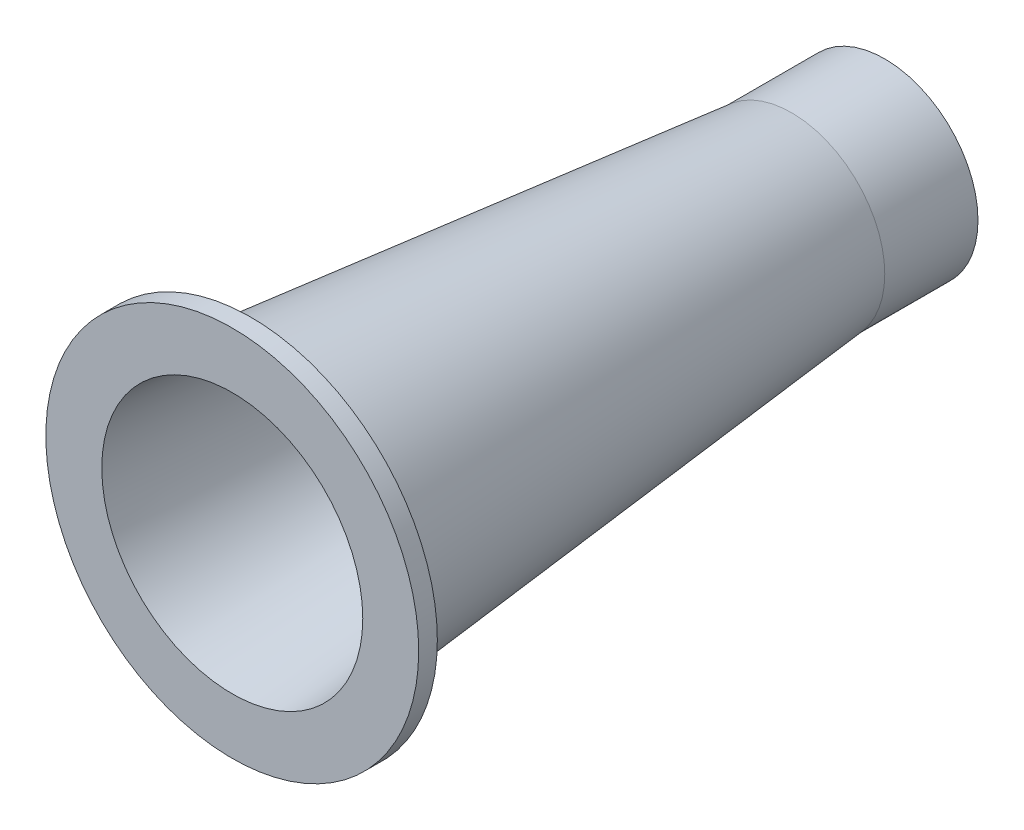
ISO-10303-21;
HEADER;
FILE_DESCRIPTION(('STEP AP214'),'2;1');
FILE_NAME('part.step','',(''),(''),'','','');
FILE_SCHEMA(('AUTOMOTIVE_DESIGN { 1 0 10303 214 1 1 1 1 }'));
ENDSEC;
DATA;
#1=APPLICATION_CONTEXT('core data for automotive mechanical design processes');
#2=APPLICATION_PROTOCOL_DEFINITION('international standard','automotive_design',2000,#1);
#3=PRODUCT_CONTEXT('',#1,'mechanical');
#4=PRODUCT('Part','Part','',(#3));
#5=PRODUCT_RELATED_PRODUCT_CATEGORY('part','',(#4));
#6=PRODUCT_DEFINITION_FORMATION('','',#4);
#7=PRODUCT_DEFINITION_CONTEXT('part definition',#1,'design');
#8=PRODUCT_DEFINITION('design','',#6,#7);
#9=PRODUCT_DEFINITION_SHAPE('','',#8);
#10=(LENGTH_UNIT() NAMED_UNIT(*) SI_UNIT(.MILLI.,.METRE.));
#11=(NAMED_UNIT(*) PLANE_ANGLE_UNIT() SI_UNIT($,.RADIAN.));
#12=(NAMED_UNIT(*) SI_UNIT($,.STERADIAN.) SOLID_ANGLE_UNIT());
#13=UNCERTAINTY_MEASURE_WITH_UNIT(LENGTH_MEASURE(1.E-05),#10,'distance_accuracy_value','');
#14=(GEOMETRIC_REPRESENTATION_CONTEXT(3) GLOBAL_UNCERTAINTY_ASSIGNED_CONTEXT((#13)) GLOBAL_UNIT_ASSIGNED_CONTEXT((#10,
#11,#12)) REPRESENTATION_CONTEXT('',''));
#15=CARTESIAN_POINT('',(0.,0.,0.));
#16=DIRECTION('',(0.,0.,1.));
#17=DIRECTION('',(1.,0.,0.));
#18=AXIS2_PLACEMENT_3D('',#15,#16,#17);
#19=CARTESIAN_POINT('',(0.,0.,396.040868454661));
#20=DIRECTION('',(0.,0.,1.));
#21=DIRECTION('',(1.,0.,0.));
#22=AXIS2_PLACEMENT_3D('',#19,#20,#21);
#23=CYLINDRICAL_SURFACE('',#22,60.);
#24=CARTESIAN_POINT('',(0.,-60.,-657.));
#25=CARTESIAN_POINT('',(0.168398425366573,-59.9999989965882,-657.000007431921));
#26=CARTESIAN_POINT('',(0.336916273700071,-59.9992834563851,-657.014226636527));
#27=CARTESIAN_POINT('',(0.669303160455142,-59.9964978138004,-657.070748210421));
#28=CARTESIAN_POINT('',(0.833166484017547,-59.9944261154742,-657.113083668137));
#29=CARTESIAN_POINT('',(1.15138127513098,-59.989162638132,-657.224622608319));
#30=CARTESIAN_POINT('',(1.30573754383423,-59.9859714300226,-657.293812398028));
#31=CARTESIAN_POINT('',(1.6006031183757,-59.9788283403306,-657.45707491939));
#32=CARTESIAN_POINT('',(1.74111568222386,-59.9748766383741,-657.551141777122));
#33=CARTESIAN_POINT('',(2.00448897861873,-59.966652640661,-657.761594016113));
#34=CARTESIAN_POINT('',(2.12733400216983,-59.9623800646756,-657.877999047214));
#35=CARTESIAN_POINT('',(2.3517512366424,-59.9539982806557,-658.12978409701));
#36=CARTESIAN_POINT('',(2.45332257857177,-59.9498890793003,-658.265164890454));
#37=CARTESIAN_POINT('',(2.63235251668381,-59.9422954402047,-658.551140898044));
#38=CARTESIAN_POINT('',(2.70979884649505,-59.9388113206681,-658.701743800503));
#39=CARTESIAN_POINT('',(2.83830164594438,-59.9328641533935,-659.013834844799));
#40=CARTESIAN_POINT('',(2.88935831584612,-59.9304010979069,-659.17532290402));
#41=CARTESIAN_POINT('',(2.9635909845662,-59.9267763445088,-659.504455710323));
#42=CARTESIAN_POINT('',(2.98679048574661,-59.9256135496585,-659.672095144403));
#43=CARTESIAN_POINT('',(3.00472278110481,-59.9247171500117,-660.00889267221));
#44=CARTESIAN_POINT('',(2.99945579992836,-59.9249835339367,-660.178050753942));
#45=CARTESIAN_POINT('',(2.96062422003688,-59.9269144325577,-660.512924048698));
#46=CARTESIAN_POINT('',(2.92708501549788,-59.9285776925714,-660.678642214643));
#47=CARTESIAN_POINT('',(2.83270039615192,-59.9331129014293,-661.002093342115));
#48=CARTESIAN_POINT('',(2.77185486595917,-59.935984855381,-661.159826269895));
#49=CARTESIAN_POINT('',(2.62455577656859,-59.9426152038194,-661.462911266187));
#50=CARTESIAN_POINT('',(2.53809063997976,-59.946373998909,-661.608257698977));
#51=CARTESIAN_POINT('',(2.34201520162709,-59.9543539680297,-661.882382210083));
#52=CARTESIAN_POINT('',(2.23240473652195,-59.9585751453237,-662.011160171462));
#53=CARTESIAN_POINT('',(1.99300677586315,-59.9670096874912,-662.248640009832));
#54=CARTESIAN_POINT('',(1.86319728955727,-59.9712230387246,-662.357319720174));
#55=CARTESIAN_POINT('',(1.58716338785269,-59.9791625847058,-662.551347226746));
#56=CARTESIAN_POINT('',(1.44093896841631,-59.9828887793337,-662.636695017235));
#57=CARTESIAN_POINT('',(1.13621301053085,-59.9894342275824,-662.781633846669));
#58=CARTESIAN_POINT('',(0.977711103566117,-59.9922534539668,-662.841224112135));
#59=CARTESIAN_POINT('',(0.652935212547705,-59.9966668370138,-662.932941852899));
#60=CARTESIAN_POINT('',(0.486661286687232,-59.9982610028474,-662.96506953379));
#61=CARTESIAN_POINT('',(0.151253702162955,-60.0000434206509,-663.000922797746));
#62=CARTESIAN_POINT('',(-0.0178766713640324,-60.0002331903175,-663.004679041221));
#63=CARTESIAN_POINT('',(-0.354365321301494,-59.999189457873,-662.983762817802));
#64=CARTESIAN_POINT('',(-0.521723603570982,-59.9979559604692,-662.959090444931));
#65=CARTESIAN_POINT('',(-0.849831465637813,-59.9942056030387,-662.882042724158));
#66=CARTESIAN_POINT('',(-1.01058434089033,-59.9916893915727,-662.829681375741));
#67=CARTESIAN_POINT('',(-1.32101971649451,-59.9856568973259,-662.698756244382));
#68=CARTESIAN_POINT('',(-1.47070215311565,-59.9821406087885,-662.620192310609));
#69=CARTESIAN_POINT('',(-1.75488849568968,-59.9744997452751,-662.439013653492));
#70=CARTESIAN_POINT('',(-1.88937928443245,-59.9703746516084,-662.336378377444));
#71=CARTESIAN_POINT('',(-2.1392327405047,-59.9619824717785,-662.110000503459));
#72=CARTESIAN_POINT('',(-2.25459528510915,-59.9577153847046,-661.986257770108));
#73=CARTESIAN_POINT('',(-2.46302075432039,-59.9495158358195,-661.721045687419));
#74=CARTESIAN_POINT('',(-2.55606384132493,-59.9455836736774,-661.579560737544));
#75=CARTESIAN_POINT('',(-2.71707365770782,-59.9385020964914,-661.282959291433));
#76=CARTESIAN_POINT('',(-2.78504049622024,-59.935352678041,-661.127842854527));
#77=CARTESIAN_POINT('',(-2.89393389885176,-59.9301938722536,-660.808455114927));
#78=CARTESIAN_POINT('',(-2.93487310952031,-59.9281839517942,-660.644188132957));
#79=CARTESIAN_POINT('',(-2.98859050542166,-59.9255292941806,-660.311101771974));
#80=CARTESIAN_POINT('',(-3.00136885053596,-59.9248845492757,-660.142282418812));
#81=CARTESIAN_POINT('',(-2.99840026325555,-59.9250331419076,-659.80508095271));
#82=CARTESIAN_POINT('',(-2.9826845390706,-59.9258249061043,-659.636698563438));
#83=CARTESIAN_POINT('',(-2.9232384350106,-59.9287539545408,-659.304966034046));
#84=CARTESIAN_POINT('',(-2.87950800174394,-59.9308912413448,-659.141615903518));
#85=CARTESIAN_POINT('',(-2.76528019803434,-59.936270092272,-658.824578260211));
#86=CARTESIAN_POINT('',(-2.69478263115303,-59.9395116644992,-658.670890818354));
#87=CARTESIAN_POINT('',(-2.52902711869758,-59.9467336338942,-658.377531349808));
#88=CARTESIAN_POINT('',(-2.43376993283366,-59.9507140083919,-658.237858893272));
#89=CARTESIAN_POINT('',(-2.22108745095746,-59.9589699320004,-657.976338316456));
#90=CARTESIAN_POINT('',(-2.10364040182092,-59.9632457681265,-657.85450789686));
#91=CARTESIAN_POINT('',(-1.84992635969463,-59.9716086731319,-657.632254921056));
#92=CARTESIAN_POINT('',(-1.71365474389562,-59.9756956953135,-657.531837638797));
#93=CARTESIAN_POINT('',(-1.42605285392879,-59.9832232569386,-657.355214459066));
#94=CARTESIAN_POINT('',(-1.27470827618635,-59.9866631731925,-657.279031852293));
#95=CARTESIAN_POINT('',(-0.961472617615379,-59.992499581247,-657.153249124375));
#96=CARTESIAN_POINT('',(-0.799594248867901,-59.9948973048604,-657.103617605235));
#97=CARTESIAN_POINT('',(-0.530591778054669,-59.9977449606177,-657.045364354502));
#98=CARTESIAN_POINT('',(-0.425210048425419,-59.9985868839932,-657.028374440276));
#99=CARTESIAN_POINT('',(-0.213234842516899,-59.9997147211616,-657.005689914645));
#100=CARTESIAN_POINT('',(-0.106641367271652,-60.0000006354288,-656.999995293601));
#101=CARTESIAN_POINT('',(0.,-60.,-657.));
#102=B_SPLINE_CURVE_WITH_KNOTS('',3,(#24,#25,#26,#27,#28,#29,#30,#31,#32,#33,#34,#35,#36,#37,
#38,#39,#40,#41,#42,#43,#44,#45,#46,#47,#48,#49,#50,#51,#52,#53,#54,#55,#56,#57,#58,#59,#60,#61,
#62,#63,#64,#65,#66,#67,#68,#69,#70,#71,#72,#73,#74,#75,#76,#77,#78,#79,#80,#81,#82,#83,#84,#85,
#86,#87,#88,#89,#90,#91,#92,#93,#94,#95,#96,#97,#98,#99,#100,#101),.UNSPECIFIED.,.T.,.F.,(4,2,2,
2,2,2,2,2,2,2,2,2,2,2,2,2,2,2,2,2,2,2,2,2,2,2,2,2,2,2,2,2,2,2,2,2,2,2,4),(0.,0.504805995312734,
1.01020712343755,1.51535089036255,2.0203754901634,2.52584638986407,3.03133793312764,
3.53708607581873,4.04283038047422,4.5481477014649,5.05346103470468,5.55832097736837,
6.06318305339178,6.56827362329482,7.07336775784431,7.57901568819297,8.08466374291855,
8.59032698083827,9.09598643319679,9.60109935181293,10.1062105998672,10.6110667086208,
11.115925723514,11.6212173788767,12.1265122760182,12.6322546304679,13.1379947838557,
13.6434981273553,14.1489986008847,14.6539457580063,15.1588938774803,15.6638457027341,
16.1687820361588,16.6742159605977,17.1797742274532,17.6858169026655,18.1912598266791,
18.5109376821229,18.8306152647956),.UNSPECIFIED.);
#103=CARTESIAN_POINT('',(0.,-60.,-657.));
#104=VERTEX_POINT('',#103);
#105=EDGE_CURVE('E78',#104,#104,#102,.T.);
#106=ORIENTED_EDGE('',*,*,#105,.F.);
#107=EDGE_LOOP('',(#106));
#108=FACE_BOUND('',#107,.T.);
#109=CARTESIAN_POINT('',(0.,0.,-599.889291706921));
#110=DIRECTION('',(0.,0.,1.));
#111=DIRECTION('',(1.,0.,0.));
#112=AXIS2_PLACEMENT_3D('',#109,#110,#111);
#113=CIRCLE('',#112,60.);
#114=CARTESIAN_POINT('',(60.,0.,-599.889291706921));
#115=VERTEX_POINT('',#114);
#116=EDGE_CURVE('E75',#115,#115,#113,.T.);
#117=ORIENTED_EDGE('',*,*,#116,.T.);
#118=EDGE_LOOP('',(#117));
#119=FACE_BOUND('',#118,.T.);
#120=CARTESIAN_POINT('',(0.,0.,-700.));
#121=DIRECTION('',(0.,0.,1.));
#122=DIRECTION('',(1.,0.,0.));
#123=AXIS2_PLACEMENT_3D('',#120,#121,#122);
#124=CIRCLE('',#123,60.);
#125=CARTESIAN_POINT('',(60.,0.,-700.));
#126=VERTEX_POINT('',#125);
#127=EDGE_CURVE('E10',#126,#126,#124,.T.);
#128=ORIENTED_EDGE('',*,*,#127,.F.);
#129=EDGE_LOOP('',(#128));
#130=FACE_BOUND('',#129,.T.);
#131=ADVANCED_FACE('F35',(#108,#119,#130),#23,.F.);
#132=CARTESIAN_POINT('',(60.,0.,-700.));
#133=DIRECTION('',(0.,0.,-1.));
#134=DIRECTION('',(-1.,0.,0.));
#135=AXIS2_PLACEMENT_3D('',#132,#133,#134);
#136=PLANE('',#135);
#137=ORIENTED_EDGE('',*,*,#127,.T.);
#138=EDGE_LOOP('',(#137));
#139=FACE_BOUND('',#138,.T.);
#140=CARTESIAN_POINT('',(0.,0.,-700.));
#141=DIRECTION('',(0.,0.,1.));
#142=DIRECTION('',(1.,0.,0.));
#143=AXIS2_PLACEMENT_3D('',#140,#141,#142);
#144=CIRCLE('',#143,100.);
#145=CARTESIAN_POINT('',(100.,0.,-700.));
#146=VERTEX_POINT('',#145);
#147=EDGE_CURVE('E48',#146,#146,#144,.T.);
#148=ORIENTED_EDGE('',*,*,#147,.F.);
#149=EDGE_LOOP('',(#148));
#150=FACE_BOUND('',#149,.T.);
#151=ADVANCED_FACE('F119',(#139,#150),#136,.T.);
#152=CARTESIAN_POINT('',(0.,0.,396.040868454661));
#153=DIRECTION('',(0.,0.,1.));
#154=DIRECTION('',(1.,0.,0.));
#155=AXIS2_PLACEMENT_3D('',#152,#153,#154);
#156=CYLINDRICAL_SURFACE('',#155,100.);
#157=CARTESIAN_POINT('',(0.,-100.,-657.));
#158=CARTESIAN_POINT('',(-0.168470650664643,-99.9999993937316,-657.000007458523));
#159=CARTESIAN_POINT('',(-0.337062493349271,-99.9995696974573,-657.014238814267));
#160=CARTESIAN_POINT('',(-0.669600282567844,-99.997896862126,-657.07081146751));
#161=CARTESIAN_POINT('',(-0.833540435343057,-99.9966527514321,-657.113186342515));
#162=CARTESIAN_POINT('',(-1.15190926485591,-99.9934919794788,-657.224836131282));
#163=CARTESIAN_POINT('',(-1.30634255176148,-99.9915756472687,-657.294097885812));
#164=CARTESIAN_POINT('',(-1.6013469266832,-99.9872865904243,-657.457536473695));
#165=CARTESIAN_POINT('',(-1.74192138716384,-99.98491397724,-657.551707224944));
#166=CARTESIAN_POINT('',(-2.00532506012357,-99.9799783016054,-657.762340996995));
#167=CARTESIAN_POINT('',(-2.1281474104159,-99.9774151660843,-657.878812598098));
#168=CARTESIAN_POINT('',(-2.35250266976238,-99.9723879718461,-658.130726919817));
#169=CARTESIAN_POINT('',(-2.45403473092434,-99.9699239170782,-658.266170395636));
#170=CARTESIAN_POINT('',(-2.63293798834301,-99.9653723879119,-658.552209175375));
#171=CARTESIAN_POINT('',(-2.71030507081176,-99.9632849776581,-658.70280705338));
#172=CARTESIAN_POINT('',(-2.838655421812,-99.9597227965447,-659.014861364377));
#173=CARTESIAN_POINT('',(-2.88963879618055,-99.9582480232276,-659.176317753806));
#174=CARTESIAN_POINT('',(-2.96375976422889,-99.9560779398813,-659.505454156817));
#175=CARTESIAN_POINT('',(-2.98690579336462,-99.95538239373,-659.673132269167));
#176=CARTESIAN_POINT('',(-3.00472102354304,-99.9548484803613,-660.009995379697));
#177=CARTESIAN_POINT('',(-2.99939033826436,-99.955010109722,-660.17918037186));
#178=CARTESIAN_POINT('',(-2.9604105957421,-99.9561721008595,-660.514197468778));
#179=CARTESIAN_POINT('',(-2.9267706599209,-99.9571721924779,-660.680030635891));
#180=CARTESIAN_POINT('',(-2.8321414388198,-99.9598979428129,-661.003694828363));
#181=CARTESIAN_POINT('',(-2.77115209333461,-99.9616236031267,-661.161525836105));
#182=CARTESIAN_POINT('',(-2.62354485412034,-99.965606270236,-661.464734784226));
#183=CARTESIAN_POINT('',(-2.53692277982905,-99.9678633636932,-661.610110688252));
#184=CARTESIAN_POINT('',(-2.34051208088291,-99.9726543639742,-661.884260382415));
#185=CARTESIAN_POINT('',(-2.23072340329848,-99.9751882714304,-662.013034134618));
#186=CARTESIAN_POINT('',(-1.99104439811985,-99.980248455371,-662.25037725009));
#187=CARTESIAN_POINT('',(-1.86114616031635,-99.982774728452,-662.358938625532));
#188=CARTESIAN_POINT('',(-1.5849632865086,-99.9875338918395,-662.552713813363));
#189=CARTESIAN_POINT('',(-1.43867864784787,-99.9897667820985,-662.637927621967));
#190=CARTESIAN_POINT('',(-1.13387104352875,-99.9936875037121,-662.782587859553));
#191=CARTESIAN_POINT('',(-0.97534795864358,-99.9953753297558,-662.842034037469));
#192=CARTESIAN_POINT('',(-0.650565377578106,-99.99801557561,-662.933466445008));
#193=CARTESIAN_POINT('',(-0.484305902458392,-99.9989679974223,-662.96545274938));
#194=CARTESIAN_POINT('',(-0.148839472658933,-100.000029817426,-663.001047643501));
#195=CARTESIAN_POINT('',(0.0203663083366717,-100.000139543945,-663.004667285366));
#196=CARTESIAN_POINT('',(0.356983144266245,-99.9995044742148,-662.983454906993));
#197=CARTESIAN_POINT('',(0.524394201279867,-99.9987596789555,-662.958622919727));
#198=CARTESIAN_POINT('',(0.852638560797185,-99.9964997167797,-662.881221322464));
#199=CARTESIAN_POINT('',(1.01347304761634,-99.9949846892335,-662.828656730497));
#200=CARTESIAN_POINT('',(1.32403509868235,-99.9913549834367,-662.697287140553));
#201=CARTESIAN_POINT('',(1.47376264062615,-99.989240303982,-662.618482089886));
#202=CARTESIAN_POINT('',(1.75791143537019,-99.9846486982771,-662.436840122324));
#203=CARTESIAN_POINT('',(1.89232793170029,-99.9821716600008,-662.333995767591));
#204=CARTESIAN_POINT('',(2.14199126317056,-99.9771348717368,-662.107205492642));
#205=CARTESIAN_POINT('',(2.2572380493222,-99.9745751215377,-661.983259518502));
#206=CARTESIAN_POINT('',(2.46532741457163,-99.9696605429637,-661.71773702865));
#207=CARTESIAN_POINT('',(2.55816286158113,-99.9673057799751,-661.576154922166));
#208=CARTESIAN_POINT('',(2.71874551436859,-99.963067695455,-661.279407717986));
#209=CARTESIAN_POINT('',(2.78649277665869,-99.9611843728615,-661.124242650888));
#210=CARTESIAN_POINT('',(2.89496347343262,-99.9581019775834,-660.804760946607));
#211=CARTESIAN_POINT('',(2.93569152328753,-99.9569027880414,-660.640445877611));
#212=CARTESIAN_POINT('',(2.98898280658843,-99.955323536737,-660.30730624447));
#213=CARTESIAN_POINT('',(3.00154606482328,-99.9549434742538,-660.138481684294));
#214=CARTESIAN_POINT('',(2.99815060350444,-99.9550453704478,-659.801186794941));
#215=CARTESIAN_POINT('',(2.98220313381423,-99.95552698912,-659.632716352296));
#216=CARTESIAN_POINT('',(2.92226204075161,-99.9572972394414,-659.300845181435));
#217=CARTESIAN_POINT('',(2.87826836178263,-99.9585858726904,-659.13744446327));
#218=CARTESIAN_POINT('',(2.76348521030234,-99.9618248327479,-658.820346773679));
#219=CARTESIAN_POINT('',(2.69269529026478,-99.9637751706075,-658.66664996437));
#220=CARTESIAN_POINT('',(2.52633300978483,-99.9681175920371,-658.373325778408));
#221=CARTESIAN_POINT('',(2.43076154555256,-99.9705096596312,-658.233697893215));
#222=CARTESIAN_POINT('',(2.21751603547025,-99.9754668328011,-657.972423414342));
#223=CARTESIAN_POINT('',(2.09983563201114,-99.9780319880133,-657.850782010848));
#224=CARTESIAN_POINT('',(1.8456892877143,-99.9830463074672,-657.628948848129));
#225=CARTESIAN_POINT('',(1.70921870253605,-99.9854954428308,-657.528762407587));
#226=CARTESIAN_POINT('',(1.42131250143886,-99.9900024922221,-657.35266607202));
#227=CARTESIAN_POINT('',(1.26986724160566,-99.9920601516065,-657.276771956668));
#228=CARTESIAN_POINT('',(0.956495111785144,-99.9955477417827,-657.151575614696));
#229=CARTESIAN_POINT('',(0.794581000480692,-99.9969784207417,-657.102241678009));
#230=CARTESIAN_POINT('',(0.52637009554849,-99.9986684734679,-657.044640022751));
#231=CARTESIAN_POINT('',(0.421814203150457,-99.9991656293739,-657.027921077751));
#232=CARTESIAN_POINT('',(0.211521467833978,-99.999831582933,-657.005598726367));
#233=CARTESIAN_POINT('',(0.105784625263436,-100.000000380683,-656.999995316709));
#234=CARTESIAN_POINT('',(0.,-100.,-657.));
#235=B_SPLINE_CURVE_WITH_KNOTS('',3,(#157,#158,#159,#160,#161,#162,#163,#164,#165,#166,#167,
#168,#169,#170,#171,#172,#173,#174,#175,#176,#177,#178,#179,#180,#181,#182,#183,#184,#185,#186,
#187,#188,#189,#190,#191,#192,#193,#194,#195,#196,#197,#198,#199,#200,#201,#202,#203,#204,#205,
#206,#207,#208,#209,#210,#211,#212,#213,#214,#215,#216,#217,#218,#219,#220,#221,#222,#223,#224,
#225,#226,#227,#228,#229,#230,#231,#232,#233,#234),.UNSPECIFIED.,.T.,.F.,(4,2,2,2,2,2,2,2,2,2,2,
2,2,2,2,2,2,2,2,2,2,2,2,2,2,2,2,2,2,2,2,2,2,2,2,2,2,2,4),(0.,0.50502582434451,1.01065527052767,
1.51603755812108,2.02129655874453,2.52675035094355,3.03222426917105,3.53778419122283,
4.04334208522753,4.54874674311414,5.05414938343416,5.55938924209878,6.06463021297252,
6.56995363142978,7.07527820443012,7.58080205715074,8.08632599182421,8.59185485192681,
9.09738233592101,9.60271284835473,10.1080427751685,10.6132812972454,11.118520833828,
11.6239169005588,12.1293142588188,12.6348722411668,13.1404290847184,13.645899547749,
14.1513695658964,14.6566401779214,15.1619117915576,15.6671918441494,16.1724536261301,
16.6778609233355,17.1833933662956,17.6892535268789,18.1945083966051,18.5116199118985,
18.8287313337745),.UNSPECIFIED.);
#236=CARTESIAN_POINT('',(0.,-100.,-657.));
#237=VERTEX_POINT('',#236);
#238=EDGE_CURVE('E39',#237,#237,#235,.T.);
#239=ORIENTED_EDGE('',*,*,#238,.F.);
#240=EDGE_LOOP('',(#239));
#241=FACE_BOUND('',#240,.T.);
#242=ORIENTED_EDGE('',*,*,#147,.T.);
#243=EDGE_LOOP('',(#242));
#244=FACE_BOUND('',#243,.T.);
#245=CARTESIAN_POINT('',(0.,0.,-600.));
#246=DIRECTION('',(0.,0.,1.));
#247=DIRECTION('',(1.,0.,0.));
#248=AXIS2_PLACEMENT_3D('',#245,#246,#247);
#249=CIRCLE('',#248,100.);
#250=CARTESIAN_POINT('',(100.,0.,-600.));
#251=VERTEX_POINT('',#250);
#252=EDGE_CURVE('E52',#251,#251,#249,.T.);
#253=ORIENTED_EDGE('',*,*,#252,.F.);
#254=EDGE_LOOP('',(#253));
#255=FACE_BOUND('',#254,.T.);
#256=ADVANCED_FACE('F115',(#241,#244,#255),#156,.T.);
#257=CARTESIAN_POINT('',(0.,0.,-20.));
#258=DIRECTION('',(0.,0.,1.));
#259=DIRECTION('',(1.,0.,0.));
#260=AXIS2_PLACEMENT_3D('',#257,#258,#259);
#261=CONICAL_SURFACE('',#260,158.096747356538,0.0998338040068001);
#262=ORIENTED_EDGE('',*,*,#252,.T.);
#263=EDGE_LOOP('',(#262));
#264=FACE_BOUND('',#263,.T.);
#265=CARTESIAN_POINT('',(0.,0.,-20.));
#266=DIRECTION('',(0.,0.,1.));
#267=DIRECTION('',(1.,0.,0.));
#268=AXIS2_PLACEMENT_3D('',#265,#266,#267);
#269=CIRCLE('',#268,158.096747356538);
#270=CARTESIAN_POINT('',(158.096747356538,0.,-20.));
#271=VERTEX_POINT('',#270);
#272=EDGE_CURVE('E57',#271,#271,#269,.T.);
#273=ORIENTED_EDGE('',*,*,#272,.F.);
#274=EDGE_LOOP('',(#273));
#275=FACE_BOUND('',#274,.T.);
#276=ADVANCED_FACE('F112',(#264,#275),#261,.T.);
#277=CARTESIAN_POINT('',(200.,0.,-20.));
#278=DIRECTION('',(0.,0.,-1.));
#279=DIRECTION('',(-1.,0.,0.));
#280=AXIS2_PLACEMENT_3D('',#277,#278,#279);
#281=PLANE('',#280);
#282=ORIENTED_EDGE('',*,*,#272,.T.);
#283=EDGE_LOOP('',(#282));
#284=FACE_BOUND('',#283,.T.);
#285=CARTESIAN_POINT('',(0.,0.,-20.));
#286=DIRECTION('',(0.,0.,1.));
#287=DIRECTION('',(1.,0.,0.));
#288=AXIS2_PLACEMENT_3D('',#285,#286,#287);
#289=CIRCLE('',#288,200.);
#290=CARTESIAN_POINT('',(200.,0.,-20.));
#291=VERTEX_POINT('',#290);
#292=EDGE_CURVE('E60',#291,#291,#289,.T.);
#293=ORIENTED_EDGE('',*,*,#292,.F.);
#294=EDGE_LOOP('',(#293));
#295=FACE_BOUND('',#294,.T.);
#296=ADVANCED_FACE('F108',(#284,#295),#281,.T.);
#297=CARTESIAN_POINT('',(0.,0.,396.040868454661));
#298=DIRECTION('',(0.,0.,1.));
#299=DIRECTION('',(1.,0.,0.));
#300=AXIS2_PLACEMENT_3D('',#297,#298,#299);
#301=CYLINDRICAL_SURFACE('',#300,200.);
#302=ORIENTED_EDGE('',*,*,#292,.T.);
#303=EDGE_LOOP('',(#302));
#304=FACE_BOUND('',#303,.T.);
#305=CARTESIAN_POINT('',(0.,0.,0.));
#306=DIRECTION('',(0.,0.,1.));
#307=DIRECTION('',(1.,0.,0.));
#308=AXIS2_PLACEMENT_3D('',#305,#306,#307);
#309=CIRCLE('',#308,200.);
#310=CARTESIAN_POINT('',(200.,0.,0.));
#311=VERTEX_POINT('',#310);
#312=EDGE_CURVE('E63',#311,#311,#309,.T.);
#313=ORIENTED_EDGE('',*,*,#312,.F.);
#314=EDGE_LOOP('',(#313));
#315=FACE_BOUND('',#314,.T.);
#316=ADVANCED_FACE('F104',(#304,#315),#301,.T.);
#317=CARTESIAN_POINT('',(140.,0.,0.));
#318=DIRECTION('',(0.,0.,1.));
#319=DIRECTION('',(1.,0.,0.));
#320=AXIS2_PLACEMENT_3D('',#317,#318,#319);
#321=PLANE('',#320);
#322=ORIENTED_EDGE('',*,*,#312,.T.);
#323=EDGE_LOOP('',(#322));
#324=FACE_BOUND('',#323,.T.);
#325=CARTESIAN_POINT('',(0.,0.,0.));
#326=DIRECTION('',(0.,0.,1.));
#327=DIRECTION('',(1.,0.,0.));
#328=AXIS2_PLACEMENT_3D('',#325,#326,#327);
#329=CIRCLE('',#328,140.);
#330=CARTESIAN_POINT('',(140.,0.,0.));
#331=VERTEX_POINT('',#330);
#332=EDGE_CURVE('E66',#331,#331,#329,.T.);
#333=ORIENTED_EDGE('',*,*,#332,.F.);
#334=EDGE_LOOP('',(#333));
#335=FACE_BOUND('',#334,.T.);
#336=ADVANCED_FACE('F100',(#324,#335),#321,.T.);
#337=CARTESIAN_POINT('',(0.,0.,-595.387631954738));
#338=DIRECTION('',(0.,0.,1.));
#339=DIRECTION('',(1.,0.,0.));
#340=AXIS2_PLACEMENT_3D('',#337,#338,#339);
#341=CONICAL_SURFACE('',#340,80.3619227019283,0.0998338040068001);
#342=ORIENTED_EDGE('',*,*,#332,.T.);
#343=EDGE_LOOP('',(#342));
#344=FACE_BOUND('',#343,.T.);
#345=CARTESIAN_POINT('',(0.,0.,-595.387631954738));
#346=DIRECTION('',(0.,0.,1.));
#347=DIRECTION('',(1.,0.,0.));
#348=AXIS2_PLACEMENT_3D('',#345,#346,#347);
#349=CIRCLE('',#348,80.3619227019283);
#350=CARTESIAN_POINT('',(80.3619227019283,0.,-595.387631954738));
#351=VERTEX_POINT('',#350);
#352=EDGE_CURVE('E69',#351,#351,#349,.T.);
#353=ORIENTED_EDGE('',*,*,#352,.F.);
#354=EDGE_LOOP('',(#353));
#355=FACE_BOUND('',#354,.T.);
#356=ADVANCED_FACE('F96',(#344,#355),#341,.F.);
#357=CARTESIAN_POINT('',(0.,0.,-594.889291706921));
#358=DIRECTION('',(0.,0.,1.));
#359=DIRECTION('',(1.,0.,0.));
#360=AXIS2_PLACEMENT_3D('',#357,#358,#359);
#361=TOROIDAL_SURFACE('',#360,75.3868189846771,5.);
#362=ORIENTED_EDGE('',*,*,#352,.T.);
#363=EDGE_LOOP('',(#362));
#364=FACE_BOUND('',#363,.T.);
#365=CARTESIAN_POINT('',(0.,0.,-599.889291706921));
#366=DIRECTION('',(0.,0.,1.));
#367=DIRECTION('',(1.,0.,0.));
#368=AXIS2_PLACEMENT_3D('',#365,#366,#367);
#369=CIRCLE('',#368,75.3868189846771);
#370=CARTESIAN_POINT('',(75.3868189846771,0.,-599.889291706921));
#371=VERTEX_POINT('',#370);
#372=EDGE_CURVE('E72',#371,#371,#369,.T.);
#373=ORIENTED_EDGE('',*,*,#372,.F.);
#374=EDGE_LOOP('',(#373));
#375=FACE_BOUND('',#374,.T.);
#376=ADVANCED_FACE('F92',(#364,#375),#361,.F.);
#377=CARTESIAN_POINT('',(60.,0.,-599.889291706921));
#378=DIRECTION('',(0.,0.,1.));
#379=DIRECTION('',(1.,0.,0.));
#380=AXIS2_PLACEMENT_3D('',#377,#378,#379);
#381=PLANE('',#380);
#382=ORIENTED_EDGE('',*,*,#372,.T.);
#383=EDGE_LOOP('',(#382));
#384=FACE_BOUND('',#383,.T.);
#385=ORIENTED_EDGE('',*,*,#116,.F.);
#386=EDGE_LOOP('',(#385));
#387=FACE_BOUND('',#386,.T.);
#388=ADVANCED_FACE('F87',(#384,#387),#381,.T.);
#389=CARTESIAN_POINT('',(0.,-200.,-660.));
#390=DIRECTION('',(0.,1.,0.));
#391=DIRECTION('',(0.,0.,1.));
#392=AXIS2_PLACEMENT_3D('',#389,#390,#391);
#393=CYLINDRICAL_SURFACE('',#392,3.);
#394=ORIENTED_EDGE('',*,*,#105,.T.);
#395=EDGE_LOOP('',(#394));
#396=FACE_BOUND('',#395,.T.);
#397=ORIENTED_EDGE('',*,*,#238,.T.);
#398=EDGE_LOOP('',(#397));
#399=FACE_BOUND('',#398,.T.);
#400=ADVANCED_FACE('F83',(#396,#399),#393,.F.);
#401=CLOSED_SHELL('',(#131,#151,#256,#276,#296,#316,#336,#356,#376,#388,#400));
#402=MANIFOLD_SOLID_BREP('B2',#401);
#403=ADVANCED_BREP_SHAPE_REPRESENTATION('',(#18,#402),#14);
#404=SHAPE_DEFINITION_REPRESENTATION(#9,#403);
ENDSEC;
END-ISO-10303-21;
